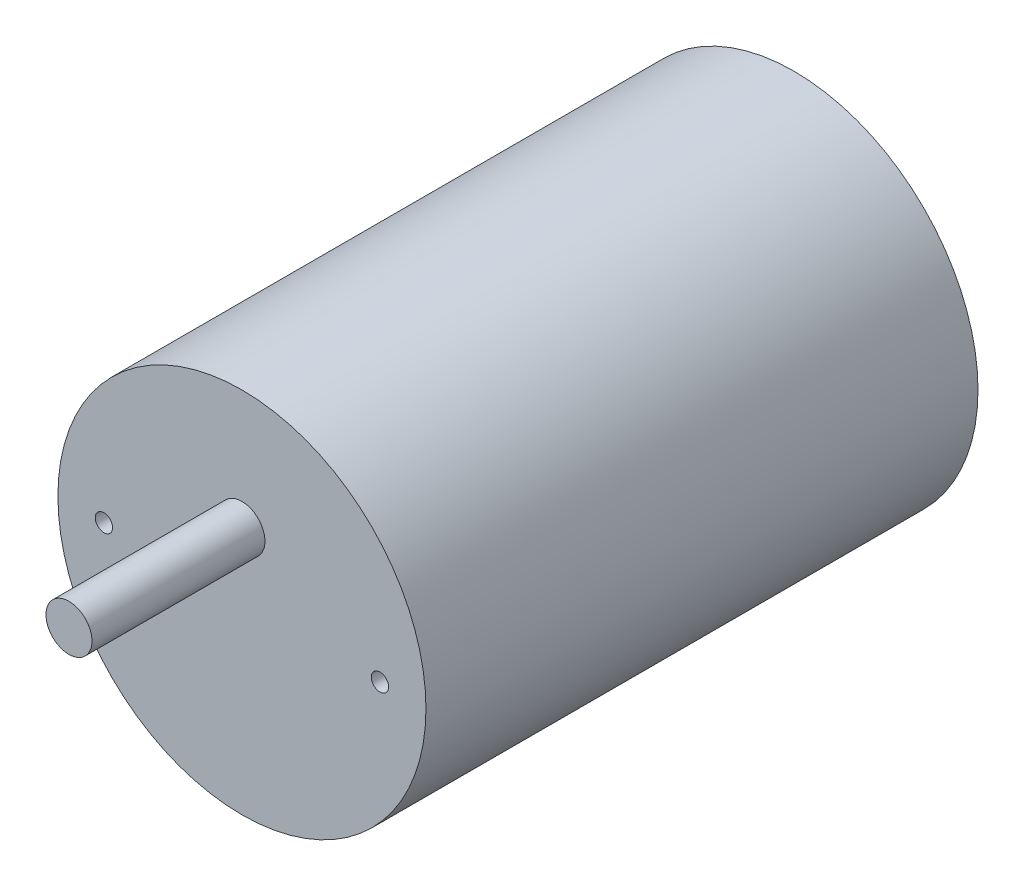
ISO-10303-21;
HEADER;
FILE_DESCRIPTION(('STEP AP214'),'2;1');
FILE_NAME('part.step','',(''),(''),'','','');
FILE_SCHEMA(('AUTOMOTIVE_DESIGN { 1 0 10303 214 1 1 1 1 }'));
ENDSEC;
DATA;
#1=APPLICATION_CONTEXT('core data for automotive mechanical design processes');
#2=APPLICATION_PROTOCOL_DEFINITION('international standard','automotive_design',2000,#1);
#3=PRODUCT_CONTEXT('',#1,'mechanical');
#4=PRODUCT('Part','Part','',(#3));
#5=PRODUCT_RELATED_PRODUCT_CATEGORY('part','',(#4));
#6=PRODUCT_DEFINITION_FORMATION('','',#4);
#7=PRODUCT_DEFINITION_CONTEXT('part definition',#1,'design');
#8=PRODUCT_DEFINITION('design','',#6,#7);
#9=PRODUCT_DEFINITION_SHAPE('','',#8);
#10=(LENGTH_UNIT() NAMED_UNIT(*) SI_UNIT(.MILLI.,.METRE.));
#11=(NAMED_UNIT(*) PLANE_ANGLE_UNIT() SI_UNIT($,.RADIAN.));
#12=(NAMED_UNIT(*) SI_UNIT($,.STERADIAN.) SOLID_ANGLE_UNIT());
#13=UNCERTAINTY_MEASURE_WITH_UNIT(LENGTH_MEASURE(1.E-05),#10,'distance_accuracy_value','');
#14=(GEOMETRIC_REPRESENTATION_CONTEXT(3) GLOBAL_UNCERTAINTY_ASSIGNED_CONTEXT((#13)) GLOBAL_UNIT_ASSIGNED_CONTEXT((#10,
#11,#12)) REPRESENTATION_CONTEXT('',''));
#15=CARTESIAN_POINT('',(0.,0.,0.));
#16=DIRECTION('',(0.,0.,1.));
#17=DIRECTION('',(1.,0.,0.));
#18=AXIS2_PLACEMENT_3D('',#15,#16,#17);
#19=CARTESIAN_POINT('',(0.,0.,76.2));
#20=DIRECTION('',(0.,0.,1.));
#21=DIRECTION('',(1.,0.,0.));
#22=AXIS2_PLACEMENT_3D('',#19,#20,#21);
#23=PLANE('',#22);
#24=CARTESIAN_POINT('',(-19.05,0.,76.2));
#25=DIRECTION('',(0.,0.,1.));
#26=DIRECTION('',(-1.,0.,0.));
#27=AXIS2_PLACEMENT_3D('',#24,#25,#26);
#28=CIRCLE('',#27,1.19681919005812);
#29=CARTESIAN_POINT('',(-20.2468191900581,0.,76.2));
#30=VERTEX_POINT('',#29);
#31=EDGE_CURVE('E56',#30,#30,#28,.T.);
#32=ORIENTED_EDGE('',*,*,#31,.F.);
#33=EDGE_LOOP('',(#32));
#34=FACE_BOUND('',#33,.T.);
#35=CARTESIAN_POINT('',(19.05,0.,76.2));
#36=DIRECTION('',(0.,0.,1.));
#37=DIRECTION('',(1.,0.,0.));
#38=AXIS2_PLACEMENT_3D('',#35,#36,#37);
#39=CIRCLE('',#38,1.19681919005812);
#40=CARTESIAN_POINT('',(20.2468191900581,0.,76.2));
#41=VERTEX_POINT('',#40);
#42=EDGE_CURVE('E50',#41,#41,#39,.T.);
#43=ORIENTED_EDGE('',*,*,#42,.F.);
#44=EDGE_LOOP('',(#43));
#45=FACE_BOUND('',#44,.T.);
#46=CARTESIAN_POINT('',(0.,0.,76.2));
#47=DIRECTION('',(0.,0.,1.));
#48=DIRECTION('',(1.,0.,0.));
#49=AXIS2_PLACEMENT_3D('',#46,#47,#48);
#50=CIRCLE('',#49,25.4);
#51=CARTESIAN_POINT('',(-25.4,0.,76.2));
#52=VERTEX_POINT('',#51);
#53=EDGE_CURVE('E10',#52,#52,#50,.T.);
#54=ORIENTED_EDGE('',*,*,#53,.T.);
#55=EDGE_LOOP('',(#54));
#56=FACE_BOUND('',#55,.T.);
#57=CARTESIAN_POINT('',(0.,8.89,76.2));
#58=DIRECTION('',(0.,0.,1.));
#59=DIRECTION('',(1.,0.,0.));
#60=AXIS2_PLACEMENT_3D('',#57,#58,#59);
#61=CIRCLE('',#60,3.175);
#62=CARTESIAN_POINT('',(3.175,8.89,76.2));
#63=VERTEX_POINT('',#62);
#64=EDGE_CURVE('E44',#63,#63,#61,.T.);
#65=ORIENTED_EDGE('',*,*,#64,.F.);
#66=EDGE_LOOP('',(#65));
#67=FACE_BOUND('',#66,.T.);
#68=ADVANCED_FACE('F31',(#34,#45,#56,#67),#23,.T.);
#69=CARTESIAN_POINT('',(0.,0.,76.2));
#70=DIRECTION('',(0.,0.,-1.));
#71=DIRECTION('',(-1.,0.,0.));
#72=AXIS2_PLACEMENT_3D('',#69,#70,#71);
#73=CYLINDRICAL_SURFACE('',#72,25.4);
#74=CARTESIAN_POINT('',(0.,0.,0.));
#75=DIRECTION('',(0.,0.,1.));
#76=DIRECTION('',(1.,0.,0.));
#77=AXIS2_PLACEMENT_3D('',#74,#75,#76);
#78=CIRCLE('',#77,25.4);
#79=CARTESIAN_POINT('',(-25.4,0.,0.));
#80=VERTEX_POINT('',#79);
#81=EDGE_CURVE('E35',#80,#80,#78,.T.);
#82=CARTESIAN_POINT('',(-25.4,0.,76.2));
#83=CARTESIAN_POINT('',(-25.4,0.,75.40625));
#84=CARTESIAN_POINT('',(-25.4,0.,74.6125));
#85=CARTESIAN_POINT('',(-25.4,0.,73.025));
#86=CARTESIAN_POINT('',(-25.4,0.,72.23125));
#87=CARTESIAN_POINT('',(-25.4,0.,70.64375));
#88=CARTESIAN_POINT('',(-25.4,0.,69.85));
#89=CARTESIAN_POINT('',(-25.4,0.,68.2625));
#90=CARTESIAN_POINT('',(-25.4,0.,67.46875));
#91=CARTESIAN_POINT('',(-25.4,0.,65.88125));
#92=CARTESIAN_POINT('',(-25.4,0.,65.0875));
#93=CARTESIAN_POINT('',(-25.4,0.,63.5));
#94=CARTESIAN_POINT('',(-25.4,0.,62.70625));
#95=CARTESIAN_POINT('',(-25.4,0.,61.11875));
#96=CARTESIAN_POINT('',(-25.4,0.,60.325));
#97=CARTESIAN_POINT('',(-25.4,0.,58.7375));
#98=CARTESIAN_POINT('',(-25.4,0.,57.94375));
#99=CARTESIAN_POINT('',(-25.4,0.,56.35625));
#100=CARTESIAN_POINT('',(-25.4,0.,55.5625));
#101=CARTESIAN_POINT('',(-25.4,0.,53.975));
#102=CARTESIAN_POINT('',(-25.4,0.,53.18125));
#103=CARTESIAN_POINT('',(-25.4,0.,51.59375));
#104=CARTESIAN_POINT('',(-25.4,0.,50.8));
#105=CARTESIAN_POINT('',(-25.4,0.,49.2125));
#106=CARTESIAN_POINT('',(-25.4,0.,48.41875));
#107=CARTESIAN_POINT('',(-25.4,0.,46.83125));
#108=CARTESIAN_POINT('',(-25.4,0.,46.0375));
#109=CARTESIAN_POINT('',(-25.4,0.,44.45));
#110=CARTESIAN_POINT('',(-25.4,0.,43.65625));
#111=CARTESIAN_POINT('',(-25.4,0.,42.06875));
#112=CARTESIAN_POINT('',(-25.4,0.,41.275));
#113=CARTESIAN_POINT('',(-25.4,0.,39.6875));
#114=CARTESIAN_POINT('',(-25.4,0.,38.89375));
#115=CARTESIAN_POINT('',(-25.4,0.,37.30625));
#116=CARTESIAN_POINT('',(-25.4,0.,36.5125));
#117=CARTESIAN_POINT('',(-25.4,0.,34.925));
#118=CARTESIAN_POINT('',(-25.4,0.,34.13125));
#119=CARTESIAN_POINT('',(-25.4,0.,32.54375));
#120=CARTESIAN_POINT('',(-25.4,0.,31.75));
#121=CARTESIAN_POINT('',(-25.4,0.,30.1625));
#122=CARTESIAN_POINT('',(-25.4,0.,29.36875));
#123=CARTESIAN_POINT('',(-25.4,0.,27.78125));
#124=CARTESIAN_POINT('',(-25.4,0.,26.9875));
#125=CARTESIAN_POINT('',(-25.4,0.,25.4));
#126=CARTESIAN_POINT('',(-25.4,0.,24.60625));
#127=CARTESIAN_POINT('',(-25.4,0.,23.01875));
#128=CARTESIAN_POINT('',(-25.4,0.,22.225));
#129=CARTESIAN_POINT('',(-25.4,0.,20.6375));
#130=CARTESIAN_POINT('',(-25.4,0.,19.84375));
#131=CARTESIAN_POINT('',(-25.4,0.,18.25625));
#132=CARTESIAN_POINT('',(-25.4,0.,17.4625));
#133=CARTESIAN_POINT('',(-25.4,0.,15.875));
#134=CARTESIAN_POINT('',(-25.4,0.,15.08125));
#135=CARTESIAN_POINT('',(-25.4,0.,13.49375));
#136=CARTESIAN_POINT('',(-25.4,0.,12.7));
#137=CARTESIAN_POINT('',(-25.4,0.,11.1125));
#138=CARTESIAN_POINT('',(-25.4,0.,10.31875));
#139=CARTESIAN_POINT('',(-25.4,0.,8.73125));
#140=CARTESIAN_POINT('',(-25.4,0.,7.93750000000001));
#141=CARTESIAN_POINT('',(-25.4,0.,6.35));
#142=CARTESIAN_POINT('',(-25.4,0.,5.55625));
#143=CARTESIAN_POINT('',(-25.4,0.,3.96875));
#144=CARTESIAN_POINT('',(-25.4,0.,3.175));
#145=CARTESIAN_POINT('',(-25.4,0.,1.5875));
#146=CARTESIAN_POINT('',(-25.4,0.,0.793750000000001));
#147=CARTESIAN_POINT('',(-25.4,0.,0.));
#148=B_SPLINE_CURVE_WITH_KNOTS('',3,(#82,#83,#84,#85,#86,#87,#88,#89,#90,#91,#92,#93,#94,#95,
#96,#97,#98,#99,#100,#101,#102,#103,#104,#105,#106,#107,#108,#109,#110,#111,#112,#113,#114,#115,
#116,#117,#118,#119,#120,#121,#122,#123,#124,#125,#126,#127,#128,#129,#130,#131,#132,#133,#134,
#135,#136,#137,#138,#139,#140,#141,#142,#143,#144,#145,#146,#147),.UNSPECIFIED.,.F.,.F.,(4,2,2,
2,2,2,2,2,2,2,2,2,2,2,2,2,2,2,2,2,2,2,2,2,2,2,2,2,2,2,2,2,4),(0.,2.38125,4.7625,7.14375,
9.52500000000001,11.90625,14.2875,16.66875,19.05,21.43125,23.8125,26.19375,28.575,30.95625,
33.3375,35.71875,38.1,40.48125,42.8625,45.24375,47.625,50.00625,52.3875,54.76875,57.15,59.53125,
61.9125,64.29375,66.675,69.05625,71.4375,73.81875,76.2),.UNSPECIFIED.);
#149=EDGE_CURVE('BSEAM33',#52,#80,#148,.T.);
#150=ORIENTED_EDGE('',*,*,#53,.F.);
#151=ORIENTED_EDGE('',*,*,#81,.T.);
#152=ORIENTED_EDGE('',*,*,#149,.T.);
#153=ORIENTED_EDGE('',*,*,#149,.F.);
#154=EDGE_LOOP('',(#150,#152,#151,#153));
#155=FACE_BOUND('',#154,.T.);
#156=ADVANCED_FACE('F33',(#155),#73,.T.);
#157=CARTESIAN_POINT('',(0.,0.,0.));
#158=DIRECTION('',(0.,0.,1.));
#159=DIRECTION('',(1.,0.,0.));
#160=AXIS2_PLACEMENT_3D('',#157,#158,#159);
#161=PLANE('',#160);
#162=ORIENTED_EDGE('',*,*,#81,.F.);
#163=EDGE_LOOP('',(#162));
#164=FACE_BOUND('',#163,.T.);
#165=ADVANCED_FACE('F81',(#164),#161,.F.);
#166=CARTESIAN_POINT('',(0.,8.89,100.076));
#167=DIRECTION('',(0.,0.,-1.));
#168=DIRECTION('',(-1.,0.,0.));
#169=AXIS2_PLACEMENT_3D('',#166,#167,#168);
#170=CYLINDRICAL_SURFACE('',#169,3.175);
#171=CARTESIAN_POINT('',(0.,8.89,100.076));
#172=DIRECTION('',(0.,0.,1.));
#173=DIRECTION('',(1.,0.,0.));
#174=AXIS2_PLACEMENT_3D('',#171,#172,#173);
#175=CIRCLE('',#174,3.175);
#176=CARTESIAN_POINT('',(3.175,8.89,100.076));
#177=VERTEX_POINT('',#176);
#178=EDGE_CURVE('E42',#177,#177,#175,.T.);
#179=ORIENTED_EDGE('',*,*,#178,.F.);
#180=EDGE_LOOP('',(#179));
#181=FACE_BOUND('',#180,.T.);
#182=ORIENTED_EDGE('',*,*,#64,.T.);
#183=EDGE_LOOP('',(#182));
#184=FACE_BOUND('',#183,.T.);
#185=ADVANCED_FACE('F78',(#181,#184),#170,.T.);
#186=CARTESIAN_POINT('',(0.,8.89,100.076));
#187=DIRECTION('',(0.,0.,1.));
#188=DIRECTION('',(1.,0.,0.));
#189=AXIS2_PLACEMENT_3D('',#186,#187,#188);
#190=PLANE('',#189);
#191=ORIENTED_EDGE('',*,*,#178,.T.);
#192=EDGE_LOOP('',(#191));
#193=FACE_BOUND('',#192,.T.);
#194=ADVANCED_FACE('F80',(#193),#190,.T.);
#195=CARTESIAN_POINT('',(19.05,0.,73.66));
#196=DIRECTION('',(0.,0.,1.));
#197=DIRECTION('',(1.,0.,0.));
#198=AXIS2_PLACEMENT_3D('',#195,#196,#197);
#199=CYLINDRICAL_SURFACE('',#198,1.19681919005812);
#200=CARTESIAN_POINT('',(19.05,0.,73.66));
#201=DIRECTION('',(0.,0.,1.));
#202=DIRECTION('',(1.,0.,0.));
#203=AXIS2_PLACEMENT_3D('',#200,#201,#202);
#204=CIRCLE('',#203,1.19681919005812);
#205=CARTESIAN_POINT('',(20.2468191900581,0.,73.66));
#206=VERTEX_POINT('',#205);
#207=EDGE_CURVE('E47',#206,#206,#204,.T.);
#208=ORIENTED_EDGE('',*,*,#207,.F.);
#209=EDGE_LOOP('',(#208));
#210=FACE_BOUND('',#209,.T.);
#211=ORIENTED_EDGE('',*,*,#42,.T.);
#212=EDGE_LOOP('',(#211));
#213=FACE_BOUND('',#212,.T.);
#214=ADVANCED_FACE('F88',(#210,#213),#199,.F.);
#215=CARTESIAN_POINT('',(19.05,0.,73.66));
#216=DIRECTION('',(0.,0.,1.));
#217=DIRECTION('',(1.,0.,0.));
#218=AXIS2_PLACEMENT_3D('',#215,#216,#217);
#219=PLANE('',#218);
#220=ORIENTED_EDGE('',*,*,#207,.T.);
#221=EDGE_LOOP('',(#220));
#222=FACE_BOUND('',#221,.T.);
#223=ADVANCED_FACE('F67',(#222),#219,.T.);
#224=CARTESIAN_POINT('',(-19.05,0.,73.66));
#225=DIRECTION('',(0.,0.,1.));
#226=DIRECTION('',(1.,0.,0.));
#227=AXIS2_PLACEMENT_3D('',#224,#225,#226);
#228=CYLINDRICAL_SURFACE('',#227,1.19681919005812);
#229=CARTESIAN_POINT('',(-19.05,0.,73.66));
#230=DIRECTION('',(0.,0.,1.));
#231=DIRECTION('',(-1.,0.,0.));
#232=AXIS2_PLACEMENT_3D('',#229,#230,#231);
#233=CIRCLE('',#232,1.19681919005812);
#234=CARTESIAN_POINT('',(-20.2468191900581,0.,73.66));
#235=VERTEX_POINT('',#234);
#236=EDGE_CURVE('E53',#235,#235,#233,.T.);
#237=ORIENTED_EDGE('',*,*,#236,.F.);
#238=EDGE_LOOP('',(#237));
#239=FACE_BOUND('',#238,.T.);
#240=ORIENTED_EDGE('',*,*,#31,.T.);
#241=EDGE_LOOP('',(#240));
#242=FACE_BOUND('',#241,.T.);
#243=ADVANCED_FACE('F64',(#239,#242),#228,.F.);
#244=CARTESIAN_POINT('',(-19.05,0.,73.66));
#245=DIRECTION('',(0.,0.,-1.));
#246=DIRECTION('',(-1.,0.,0.));
#247=AXIS2_PLACEMENT_3D('',#244,#245,#246);
#248=PLANE('',#247);
#249=ORIENTED_EDGE('',*,*,#236,.T.);
#250=EDGE_LOOP('',(#249));
#251=FACE_BOUND('',#250,.T.);
#252=ADVANCED_FACE('F62',(#251),#248,.F.);
#253=CLOSED_SHELL('',(#68,#156,#165,#185,#194,#214,#223,#243,#252));
#254=MANIFOLD_SOLID_BREP('B2',#253);
#255=ADVANCED_BREP_SHAPE_REPRESENTATION('',(#18,#254),#14);
#256=SHAPE_DEFINITION_REPRESENTATION(#9,#255);
ENDSEC;
END-ISO-10303-21;
